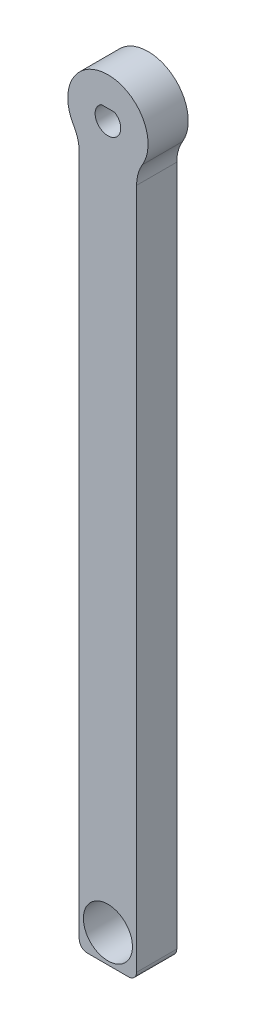
ISO-10303-21;
HEADER;
FILE_DESCRIPTION(('STEP AP214'),'2;1');
FILE_NAME('part.step','',(''),(''),'','','');
FILE_SCHEMA(('AUTOMOTIVE_DESIGN { 1 0 10303 214 1 1 1 1 }'));
ENDSEC;
DATA;
#1=APPLICATION_CONTEXT('core data for automotive mechanical design processes');
#2=APPLICATION_PROTOCOL_DEFINITION('international standard','automotive_design',2000,#1);
#3=PRODUCT_CONTEXT('',#1,'mechanical');
#4=PRODUCT('Part','Part','',(#3));
#5=PRODUCT_RELATED_PRODUCT_CATEGORY('part','',(#4));
#6=PRODUCT_DEFINITION_FORMATION('','',#4);
#7=PRODUCT_DEFINITION_CONTEXT('part definition',#1,'design');
#8=PRODUCT_DEFINITION('design','',#6,#7);
#9=PRODUCT_DEFINITION_SHAPE('','',#8);
#10=(LENGTH_UNIT() NAMED_UNIT(*) SI_UNIT(.MILLI.,.METRE.));
#11=(NAMED_UNIT(*) PLANE_ANGLE_UNIT() SI_UNIT($,.RADIAN.));
#12=(NAMED_UNIT(*) SI_UNIT($,.STERADIAN.) SOLID_ANGLE_UNIT());
#13=UNCERTAINTY_MEASURE_WITH_UNIT(LENGTH_MEASURE(1.E-05),#10,'distance_accuracy_value','');
#14=(GEOMETRIC_REPRESENTATION_CONTEXT(3) GLOBAL_UNCERTAINTY_ASSIGNED_CONTEXT((#13)) GLOBAL_UNIT_ASSIGNED_CONTEXT((#10,
#11,#12)) REPRESENTATION_CONTEXT('',''));
#15=CARTESIAN_POINT('',(0.,0.,0.));
#16=DIRECTION('',(0.,0.,1.));
#17=DIRECTION('',(1.,0.,0.));
#18=AXIS2_PLACEMENT_3D('',#15,#16,#17);
#19=CARTESIAN_POINT('',(0.,0.,10.));
#20=DIRECTION('',(0.,0.,-1.));
#21=DIRECTION('',(-1.,0.,0.));
#22=AXIS2_PLACEMENT_3D('',#19,#20,#21);
#23=CYLINDRICAL_SURFACE('',#22,10.);
#24=CARTESIAN_POINT('',(0.,0.,0.));
#25=DIRECTION('',(0.,0.,1.));
#26=DIRECTION('',(1.,0.,0.));
#27=AXIS2_PLACEMENT_3D('',#24,#25,#26);
#28=CIRCLE('',#27,10.);
#29=CARTESIAN_POINT('',(8.57071421427143,-5.15197611187064,0.));
#30=VERTEX_POINT('',#29);
#31=CARTESIAN_POINT('',(-8.57071421427143,-5.15197611187064,0.));
#32=VERTEX_POINT('',#31);
#33=EDGE_CURVE('E142',#30,#32,#28,.T.);
#34=ORIENTED_EDGE('',*,*,#33,.T.);
#35=DIRECTION('',(0.,0.,-1.));
#36=VECTOR('',#35,1.);
#37=CARTESIAN_POINT('',(-8.57071421427143,-5.15197611187064,10.));
#38=LINE('',#37,#36);
#39=CARTESIAN_POINT('',(-8.57071421427143,-5.15197611187064,10.));
#40=VERTEX_POINT('',#39);
#41=EDGE_CURVE('E168',#32,#40,#38,.F.);
#42=ORIENTED_EDGE('',*,*,#41,.T.);
#43=CARTESIAN_POINT('',(0.,0.,10.));
#44=DIRECTION('',(0.,0.,1.));
#45=DIRECTION('',(1.,0.,0.));
#46=AXIS2_PLACEMENT_3D('',#43,#44,#45);
#47=CIRCLE('',#46,10.);
#48=CARTESIAN_POINT('',(8.57071421427143,-5.15197611187064,10.));
#49=VERTEX_POINT('',#48);
#50=EDGE_CURVE('E138',#49,#40,#47,.T.);
#51=ORIENTED_EDGE('',*,*,#50,.F.);
#52=DIRECTION('',(0.,0.,-1.));
#53=VECTOR('',#52,1.);
#54=CARTESIAN_POINT('',(8.57071421427143,-5.15197611187064,10.));
#55=LINE('',#54,#53);
#56=EDGE_CURVE('E164',#49,#30,#55,.T.);
#57=ORIENTED_EDGE('',*,*,#56,.T.);
#58=EDGE_LOOP('',(#34,#42,#51,#57));
#59=FACE_BOUND('',#58,.T.);
#60=ADVANCED_FACE('F41',(#59),#23,.T.);
#61=CARTESIAN_POINT('',(0.,0.,10.));
#62=DIRECTION('',(0.,0.,1.));
#63=DIRECTION('',(1.,0.,0.));
#64=AXIS2_PLACEMENT_3D('',#61,#62,#63);
#65=PLANE('',#64);
#66=CARTESIAN_POINT('',(0.,-175.,10.));
#67=DIRECTION('',(0.,0.,-1.));
#68=DIRECTION('',(-1.,0.,0.));
#69=AXIS2_PLACEMENT_3D('',#66,#67,#68);
#70=CIRCLE('',#69,6.11);
#71=CARTESIAN_POINT('',(-6.11,-175.,10.));
#72=VERTEX_POINT('',#71);
#73=EDGE_CURVE('E240',#72,#72,#70,.T.);
#74=ORIENTED_EDGE('',*,*,#73,.T.);
#75=EDGE_LOOP('',(#74));
#76=FACE_BOUND('',#75,.T.);
#77=CARTESIAN_POINT('',(0.,0.,10.));
#78=DIRECTION('',(0.,0.,1.));
#79=DIRECTION('',(1.,0.,0.));
#80=AXIS2_PLACEMENT_3D('',#77,#78,#79);
#81=CIRCLE('',#80,3.19);
#82=CARTESIAN_POINT('',(-1.66664333317,2.72,10.));
#83=VERTEX_POINT('',#82);
#84=CARTESIAN_POINT('',(1.66664333317,2.72,10.));
#85=VERTEX_POINT('',#84);
#86=EDGE_CURVE('E123',#83,#85,#81,.T.);
#87=ORIENTED_EDGE('',*,*,#86,.F.);
#88=DIRECTION('',(1.,0.,0.));
#89=VECTOR('',#88,1.);
#90=CARTESIAN_POINT('',(0.,2.72,10.));
#91=LINE('',#90,#89);
#92=EDGE_CURVE('E134',#83,#85,#91,.T.);
#93=ORIENTED_EDGE('',*,*,#92,.T.);
#94=EDGE_LOOP('',(#87,#93));
#95=FACE_BOUND('',#94,.T.);
#96=DIRECTION('',(0.,1.,0.));
#97=VECTOR('',#96,1.);
#98=CARTESIAN_POINT('',(-7.14142842854285,-182.,10.));
#99=LINE('',#98,#97);
#100=CARTESIAN_POINT('',(-7.14142842854285,-180.,10.));
#101=VERTEX_POINT('',#100);
#102=CARTESIAN_POINT('',(-7.14142842854285,-10.3039522237413,10.));
#103=VERTEX_POINT('',#102);
#104=EDGE_CURVE('E210',#101,#103,#99,.T.);
#105=ORIENTED_EDGE('',*,*,#104,.F.);
#106=CARTESIAN_POINT('',(-5.14142842854285,-180.,10.));
#107=DIRECTION('',(0.,0.,1.));
#108=DIRECTION('',(1.,0.,0.));
#109=AXIS2_PLACEMENT_3D('',#106,#107,#108);
#110=CIRCLE('',#109,2.);
#111=CARTESIAN_POINT('',(-5.14142842854285,-182.,10.));
#112=VERTEX_POINT('',#111);
#113=EDGE_CURVE('E50',#101,#112,#110,.T.);
#114=ORIENTED_EDGE('',*,*,#113,.T.);
#115=DIRECTION('',(-1.,0.,0.));
#116=VECTOR('',#115,1.);
#117=CARTESIAN_POINT('',(7.14142842854285,-182.,10.));
#118=LINE('',#117,#116);
#119=CARTESIAN_POINT('',(5.14142842854285,-182.,10.));
#120=VERTEX_POINT('',#119);
#121=EDGE_CURVE('E209',#120,#112,#118,.T.);
#122=ORIENTED_EDGE('',*,*,#121,.F.);
#123=CARTESIAN_POINT('',(5.14142842854285,-180.,10.));
#124=DIRECTION('',(0.,0.,1.));
#125=DIRECTION('',(1.,0.,0.));
#126=AXIS2_PLACEMENT_3D('',#123,#124,#125);
#127=CIRCLE('',#126,2.);
#128=CARTESIAN_POINT('',(7.14142842854285,-180.,10.));
#129=VERTEX_POINT('',#128);
#130=EDGE_CURVE('E57',#120,#129,#127,.T.);
#131=ORIENTED_EDGE('',*,*,#130,.T.);
#132=DIRECTION('',(0.,1.,0.));
#133=VECTOR('',#132,1.);
#134=CARTESIAN_POINT('',(7.14142842854285,-182.,10.));
#135=LINE('',#134,#133);
#136=CARTESIAN_POINT('',(7.14142842854285,-10.3039522237413,10.));
#137=VERTEX_POINT('',#136);
#138=EDGE_CURVE('E230',#129,#137,#135,.T.);
#139=ORIENTED_EDGE('',*,*,#138,.T.);
#140=CARTESIAN_POINT('',(17.1414284285429,-10.3039522237413,10.));
#141=DIRECTION('',(0.,0.,1.));
#142=DIRECTION('',(1.,0.,0.));
#143=AXIS2_PLACEMENT_3D('',#140,#141,#142);
#144=CIRCLE('',#143,10.);
#145=EDGE_CURVE('E186',#137,#49,#144,.F.);
#146=ORIENTED_EDGE('',*,*,#145,.T.);
#147=ORIENTED_EDGE('',*,*,#50,.T.);
#148=CARTESIAN_POINT('',(-17.1414284285429,-10.3039522237413,10.));
#149=DIRECTION('',(0.,0.,1.));
#150=DIRECTION('',(1.,0.,0.));
#151=AXIS2_PLACEMENT_3D('',#148,#149,#150);
#152=CIRCLE('',#151,10.);
#153=EDGE_CURVE('E178',#40,#103,#152,.F.);
#154=ORIENTED_EDGE('',*,*,#153,.T.);
#155=EDGE_LOOP('',(#105,#114,#122,#131,#139,#146,#147,#154));
#156=FACE_BOUND('',#155,.T.);
#157=ADVANCED_FACE('F140',(#76,#95,#156),#65,.T.);
#158=CARTESIAN_POINT('',(0.,0.,0.));
#159=DIRECTION('',(0.,0.,1.));
#160=DIRECTION('',(1.,0.,0.));
#161=AXIS2_PLACEMENT_3D('',#158,#159,#160);
#162=PLANE('',#161);
#163=CARTESIAN_POINT('',(0.,-175.,0.));
#164=DIRECTION('',(0.,0.,-1.));
#165=DIRECTION('',(-1.,0.,0.));
#166=AXIS2_PLACEMENT_3D('',#163,#164,#165);
#167=CIRCLE('',#166,6.11);
#168=CARTESIAN_POINT('',(-6.11,-175.,0.));
#169=VERTEX_POINT('',#168);
#170=EDGE_CURVE('E241',#169,#169,#167,.T.);
#171=ORIENTED_EDGE('',*,*,#170,.F.);
#172=EDGE_LOOP('',(#171));
#173=FACE_BOUND('',#172,.T.);
#174=CARTESIAN_POINT('',(0.,0.,0.));
#175=DIRECTION('',(0.,0.,1.));
#176=DIRECTION('',(1.,0.,0.));
#177=AXIS2_PLACEMENT_3D('',#174,#175,#176);
#178=CIRCLE('',#177,3.19);
#179=CARTESIAN_POINT('',(-1.66664333317,2.72,0.));
#180=VERTEX_POINT('',#179);
#181=CARTESIAN_POINT('',(1.66664333317,2.72,0.));
#182=VERTEX_POINT('',#181);
#183=EDGE_CURVE('E125',#180,#182,#178,.T.);
#184=ORIENTED_EDGE('',*,*,#183,.T.);
#185=DIRECTION('',(1.,0.,0.));
#186=VECTOR('',#185,1.);
#187=CARTESIAN_POINT('',(0.,2.72,0.));
#188=LINE('',#187,#186);
#189=EDGE_CURVE('E146',#180,#182,#188,.T.);
#190=ORIENTED_EDGE('',*,*,#189,.F.);
#191=EDGE_LOOP('',(#184,#190));
#192=FACE_BOUND('',#191,.T.);
#193=DIRECTION('',(1.,0.,0.));
#194=VECTOR('',#193,1.);
#195=CARTESIAN_POINT('',(-7.14142842854285,-182.,0.));
#196=LINE('',#195,#194);
#197=CARTESIAN_POINT('',(-5.14142842854285,-182.,0.));
#198=VERTEX_POINT('',#197);
#199=CARTESIAN_POINT('',(5.14142842854285,-182.,0.));
#200=VERTEX_POINT('',#199);
#201=EDGE_CURVE('E219',#198,#200,#196,.T.);
#202=ORIENTED_EDGE('',*,*,#201,.F.);
#203=CARTESIAN_POINT('',(-5.14142842854285,-180.,0.));
#204=DIRECTION('',(0.,0.,1.));
#205=DIRECTION('',(1.,0.,0.));
#206=AXIS2_PLACEMENT_3D('',#203,#204,#205);
#207=CIRCLE('',#206,2.);
#208=CARTESIAN_POINT('',(-7.14142842854285,-180.,0.));
#209=VERTEX_POINT('',#208);
#210=EDGE_CURVE('E200',#198,#209,#207,.F.);
#211=ORIENTED_EDGE('',*,*,#210,.T.);
#212=DIRECTION('',(0.,1.,0.));
#213=VECTOR('',#212,1.);
#214=CARTESIAN_POINT('',(-7.14142842854285,-182.,0.));
#215=LINE('',#214,#213);
#216=CARTESIAN_POINT('',(-7.14142842854285,-10.3039522237413,0.));
#217=VERTEX_POINT('',#216);
#218=EDGE_CURVE('E149',#209,#217,#215,.T.);
#219=ORIENTED_EDGE('',*,*,#218,.T.);
#220=CARTESIAN_POINT('',(-17.1414284285429,-10.3039522237413,0.));
#221=DIRECTION('',(0.,0.,1.));
#222=DIRECTION('',(1.,0.,0.));
#223=AXIS2_PLACEMENT_3D('',#220,#221,#222);
#224=CIRCLE('',#223,10.);
#225=EDGE_CURVE('E175',#217,#32,#224,.T.);
#226=ORIENTED_EDGE('',*,*,#225,.T.);
#227=ORIENTED_EDGE('',*,*,#33,.F.);
#228=CARTESIAN_POINT('',(17.1414284285429,-10.3039522237413,0.));
#229=DIRECTION('',(0.,0.,1.));
#230=DIRECTION('',(1.,0.,0.));
#231=AXIS2_PLACEMENT_3D('',#228,#229,#230);
#232=CIRCLE('',#231,10.);
#233=CARTESIAN_POINT('',(7.14142842854285,-10.3039522237413,0.));
#234=VERTEX_POINT('',#233);
#235=EDGE_CURVE('E182',#30,#234,#232,.T.);
#236=ORIENTED_EDGE('',*,*,#235,.T.);
#237=DIRECTION('',(0.,1.,0.));
#238=VECTOR('',#237,1.);
#239=CARTESIAN_POINT('',(7.14142842854285,-182.,0.));
#240=LINE('',#239,#238);
#241=CARTESIAN_POINT('',(7.14142842854285,-180.,0.));
#242=VERTEX_POINT('',#241);
#243=EDGE_CURVE('E228',#242,#234,#240,.T.);
#244=ORIENTED_EDGE('',*,*,#243,.F.);
#245=CARTESIAN_POINT('',(5.14142842854285,-180.,0.));
#246=DIRECTION('',(0.,0.,1.));
#247=DIRECTION('',(1.,0.,0.));
#248=AXIS2_PLACEMENT_3D('',#245,#246,#247);
#249=CIRCLE('',#248,2.);
#250=EDGE_CURVE('E197',#242,#200,#249,.F.);
#251=ORIENTED_EDGE('',*,*,#250,.T.);
#252=EDGE_LOOP('',(#202,#211,#219,#226,#227,#236,#244,#251));
#253=FACE_BOUND('',#252,.T.);
#254=ADVANCED_FACE('F223',(#173,#192,#253),#162,.F.);
#255=CARTESIAN_POINT('',(0.,0.,10.));
#256=DIRECTION('',(0.,0.,-1.));
#257=DIRECTION('',(-1.,0.,0.));
#258=AXIS2_PLACEMENT_3D('',#255,#256,#257);
#259=CYLINDRICAL_SURFACE('',#258,3.19);
#260=ORIENTED_EDGE('',*,*,#183,.F.);
#261=DIRECTION('',(0.,0.,-1.));
#262=VECTOR('',#261,1.);
#263=CARTESIAN_POINT('',(-1.66664333317,2.72,10.));
#264=LINE('',#263,#262);
#265=EDGE_CURVE('E119',#83,#180,#264,.T.);
#266=ORIENTED_EDGE('',*,*,#265,.F.);
#267=ORIENTED_EDGE('',*,*,#86,.T.);
#268=DIRECTION('',(0.,0.,-1.));
#269=VECTOR('',#268,1.);
#270=CARTESIAN_POINT('',(1.66664333317,2.72,10.));
#271=LINE('',#270,#269);
#272=EDGE_CURVE('E131',#85,#182,#271,.T.);
#273=ORIENTED_EDGE('',*,*,#272,.T.);
#274=EDGE_LOOP('',(#260,#266,#267,#273));
#275=FACE_BOUND('',#274,.T.);
#276=ADVANCED_FACE('F121',(#275),#259,.F.);
#277=CARTESIAN_POINT('',(0.,2.72,10.));
#278=DIRECTION('',(0.,1.,0.));
#279=DIRECTION('',(0.,0.,1.));
#280=AXIS2_PLACEMENT_3D('',#277,#278,#279);
#281=PLANE('',#280);
#282=ORIENTED_EDGE('',*,*,#189,.T.);
#283=ORIENTED_EDGE('',*,*,#272,.F.);
#284=ORIENTED_EDGE('',*,*,#92,.F.);
#285=ORIENTED_EDGE('',*,*,#265,.T.);
#286=EDGE_LOOP('',(#282,#283,#284,#285));
#287=FACE_BOUND('',#286,.T.);
#288=ADVANCED_FACE('F135',(#287),#281,.F.);
#289=CARTESIAN_POINT('',(-7.14142842854285,-182.,10.));
#290=DIRECTION('',(1.,0.,0.));
#291=DIRECTION('',(0.,0.,-1.));
#292=AXIS2_PLACEMENT_3D('',#289,#290,#291);
#293=PLANE('',#292);
#294=ORIENTED_EDGE('',*,*,#218,.F.);
#295=DIRECTION('',(0.,0.,-1.));
#296=VECTOR('',#295,1.);
#297=CARTESIAN_POINT('',(-7.14142842854285,-180.,10.));
#298=LINE('',#297,#296);
#299=EDGE_CURVE('E65',#209,#101,#298,.F.);
#300=ORIENTED_EDGE('',*,*,#299,.T.);
#301=ORIENTED_EDGE('',*,*,#104,.T.);
#302=DIRECTION('',(0.,0.,1.));
#303=VECTOR('',#302,1.);
#304=CARTESIAN_POINT('',(-7.14142842854285,-10.3039522237413,0.));
#305=LINE('',#304,#303);
#306=EDGE_CURVE('E130',#103,#217,#305,.F.);
#307=ORIENTED_EDGE('',*,*,#306,.T.);
#308=EDGE_LOOP('',(#294,#300,#301,#307));
#309=FACE_BOUND('',#308,.T.);
#310=ADVANCED_FACE('F225',(#309),#293,.F.);
#311=CARTESIAN_POINT('',(7.14142842854285,-182.,0.));
#312=DIRECTION('',(-1.,0.,0.));
#313=DIRECTION('',(0.,0.,1.));
#314=AXIS2_PLACEMENT_3D('',#311,#312,#313);
#315=PLANE('',#314);
#316=ORIENTED_EDGE('',*,*,#138,.F.);
#317=DIRECTION('',(0.,0.,1.));
#318=VECTOR('',#317,1.);
#319=CARTESIAN_POINT('',(7.14142842854285,-180.,0.));
#320=LINE('',#319,#318);
#321=EDGE_CURVE('E11',#129,#242,#320,.F.);
#322=ORIENTED_EDGE('',*,*,#321,.T.);
#323=ORIENTED_EDGE('',*,*,#243,.T.);
#324=DIRECTION('',(0.,0.,1.));
#325=VECTOR('',#324,1.);
#326=CARTESIAN_POINT('',(7.14142842854285,-10.3039522237413,10.));
#327=LINE('',#326,#325);
#328=EDGE_CURVE('E171',#234,#137,#327,.T.);
#329=ORIENTED_EDGE('',*,*,#328,.T.);
#330=EDGE_LOOP('',(#316,#322,#323,#329));
#331=FACE_BOUND('',#330,.T.);
#332=ADVANCED_FACE('F296',(#331),#315,.F.);
#333=CARTESIAN_POINT('',(0.,-182.,0.));
#334=DIRECTION('',(0.,-1.,0.));
#335=DIRECTION('',(0.,0.,-1.));
#336=AXIS2_PLACEMENT_3D('',#333,#334,#335);
#337=PLANE('',#336);
#338=ORIENTED_EDGE('',*,*,#121,.T.);
#339=DIRECTION('',(0.,0.,-1.));
#340=VECTOR('',#339,1.);
#341=CARTESIAN_POINT('',(-5.14142842854285,-182.,0.));
#342=LINE('',#341,#340);
#343=EDGE_CURVE('E193',#112,#198,#342,.T.);
#344=ORIENTED_EDGE('',*,*,#343,.T.);
#345=ORIENTED_EDGE('',*,*,#201,.T.);
#346=DIRECTION('',(0.,0.,1.));
#347=VECTOR('',#346,1.);
#348=CARTESIAN_POINT('',(5.14142842854285,-182.,10.));
#349=LINE('',#348,#347);
#350=EDGE_CURVE('E189',#200,#120,#349,.T.);
#351=ORIENTED_EDGE('',*,*,#350,.T.);
#352=EDGE_LOOP('',(#338,#344,#345,#351));
#353=FACE_BOUND('',#352,.T.);
#354=ADVANCED_FACE('F214',(#353),#337,.T.);
#355=CARTESIAN_POINT('',(0.,-175.,10.));
#356=DIRECTION('',(0.,0.,-1.));
#357=DIRECTION('',(-1.,0.,0.));
#358=AXIS2_PLACEMENT_3D('',#355,#356,#357);
#359=CYLINDRICAL_SURFACE('',#358,6.11);
#360=ORIENTED_EDGE('',*,*,#73,.F.);
#361=EDGE_LOOP('',(#360));
#362=FACE_BOUND('',#361,.T.);
#363=ORIENTED_EDGE('',*,*,#170,.T.);
#364=EDGE_LOOP('',(#363));
#365=FACE_BOUND('',#364,.T.);
#366=ADVANCED_FACE('F250',(#362,#365),#359,.F.);
#367=CARTESIAN_POINT('',(-17.1414284285429,-10.3039522237413,10.));
#368=DIRECTION('',(0.,0.,-1.));
#369=DIRECTION('',(-1.,0.,0.));
#370=AXIS2_PLACEMENT_3D('',#367,#368,#369);
#371=CYLINDRICAL_SURFACE('',#370,10.);
#372=ORIENTED_EDGE('',*,*,#153,.F.);
#373=ORIENTED_EDGE('',*,*,#41,.F.);
#374=ORIENTED_EDGE('',*,*,#225,.F.);
#375=ORIENTED_EDGE('',*,*,#306,.F.);
#376=EDGE_LOOP('',(#372,#373,#374,#375));
#377=FACE_BOUND('',#376,.T.);
#378=ADVANCED_FACE('F253',(#377),#371,.F.);
#379=CARTESIAN_POINT('',(17.1414284285429,-10.3039522237413,10.));
#380=DIRECTION('',(0.,0.,-1.));
#381=DIRECTION('',(-1.,0.,0.));
#382=AXIS2_PLACEMENT_3D('',#379,#380,#381);
#383=CYLINDRICAL_SURFACE('',#382,10.);
#384=ORIENTED_EDGE('',*,*,#145,.F.);
#385=ORIENTED_EDGE('',*,*,#328,.F.);
#386=ORIENTED_EDGE('',*,*,#235,.F.);
#387=ORIENTED_EDGE('',*,*,#56,.F.);
#388=EDGE_LOOP('',(#384,#385,#386,#387));
#389=FACE_BOUND('',#388,.T.);
#390=ADVANCED_FACE('F279',(#389),#383,.F.);
#391=CARTESIAN_POINT('',(-5.14142842854285,-180.,0.));
#392=DIRECTION('',(0.,0.,1.));
#393=DIRECTION('',(1.,0.,0.));
#394=AXIS2_PLACEMENT_3D('',#391,#392,#393);
#395=CYLINDRICAL_SURFACE('',#394,2.);
#396=ORIENTED_EDGE('',*,*,#113,.F.);
#397=ORIENTED_EDGE('',*,*,#299,.F.);
#398=ORIENTED_EDGE('',*,*,#210,.F.);
#399=ORIENTED_EDGE('',*,*,#343,.F.);
#400=EDGE_LOOP('',(#396,#397,#398,#399));
#401=FACE_BOUND('',#400,.T.);
#402=ADVANCED_FACE('F221',(#401),#395,.T.);
#403=CARTESIAN_POINT('',(5.14142842854285,-180.,0.));
#404=DIRECTION('',(0.,0.,-1.));
#405=DIRECTION('',(-1.,0.,0.));
#406=AXIS2_PLACEMENT_3D('',#403,#404,#405);
#407=CYLINDRICAL_SURFACE('',#406,2.);
#408=ORIENTED_EDGE('',*,*,#250,.F.);
#409=ORIENTED_EDGE('',*,*,#321,.F.);
#410=ORIENTED_EDGE('',*,*,#130,.F.);
#411=ORIENTED_EDGE('',*,*,#350,.F.);
#412=EDGE_LOOP('',(#408,#409,#410,#411));
#413=FACE_BOUND('',#412,.T.);
#414=ADVANCED_FACE('F43',(#413),#407,.T.);
#415=CLOSED_SHELL('',(#60,#157,#254,#276,#288,#310,#332,#354,#366,#378,#390,#402,#414));
#416=MANIFOLD_SOLID_BREP('B2',#415);
#417=ADVANCED_BREP_SHAPE_REPRESENTATION('',(#18,#416),#14);
#418=SHAPE_DEFINITION_REPRESENTATION(#9,#417);
ENDSEC;
END-ISO-10303-21;
